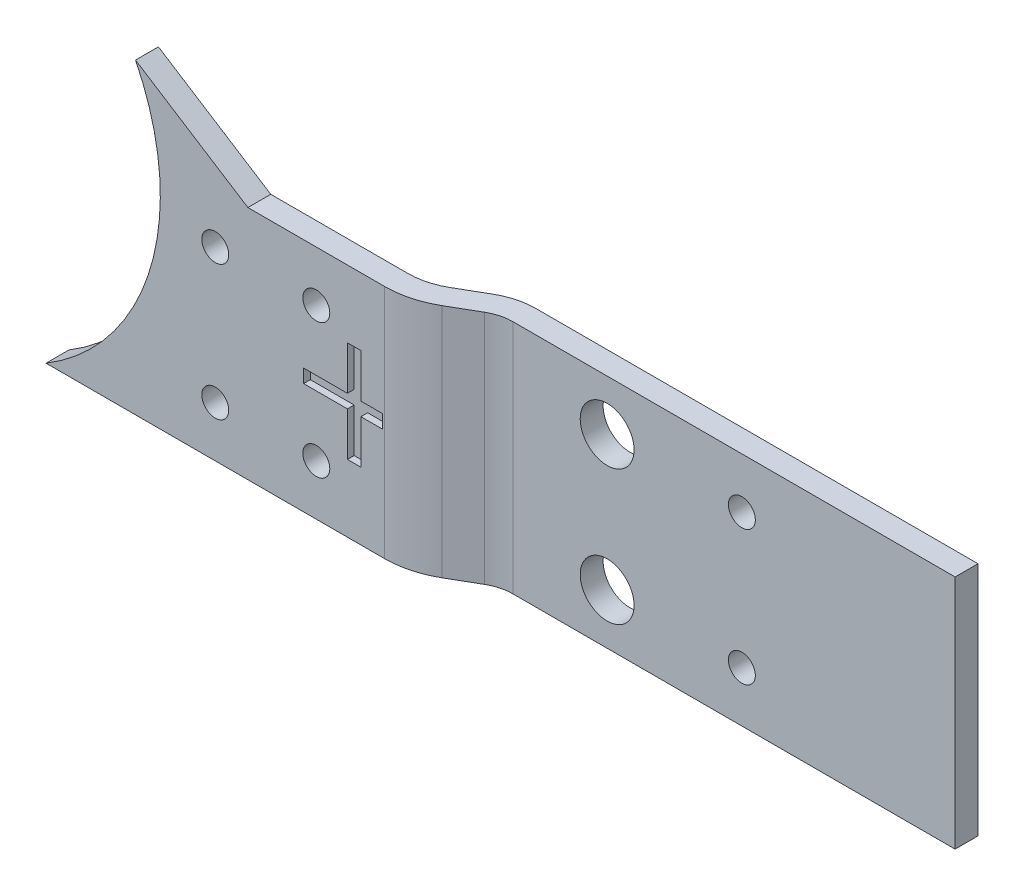
ISO-10303-21;
HEADER;
FILE_DESCRIPTION(('STEP AP214'),'2;1');
FILE_NAME('part.step','',(''),(''),'','','');
FILE_SCHEMA(('AUTOMOTIVE_DESIGN { 1 0 10303 214 1 1 1 1 }'));
ENDSEC;
DATA;
#1=APPLICATION_CONTEXT('core data for automotive mechanical design processes');
#2=APPLICATION_PROTOCOL_DEFINITION('international standard','automotive_design',2000,#1);
#3=PRODUCT_CONTEXT('',#1,'mechanical');
#4=PRODUCT('Part','Part','',(#3));
#5=PRODUCT_RELATED_PRODUCT_CATEGORY('part','',(#4));
#6=PRODUCT_DEFINITION_FORMATION('','',#4);
#7=PRODUCT_DEFINITION_CONTEXT('part definition',#1,'design');
#8=PRODUCT_DEFINITION('design','',#6,#7);
#9=PRODUCT_DEFINITION_SHAPE('','',#8);
#10=(LENGTH_UNIT() NAMED_UNIT(*) SI_UNIT(.MILLI.,.METRE.));
#11=(NAMED_UNIT(*) PLANE_ANGLE_UNIT() SI_UNIT($,.RADIAN.));
#12=(NAMED_UNIT(*) SI_UNIT($,.STERADIAN.) SOLID_ANGLE_UNIT());
#13=UNCERTAINTY_MEASURE_WITH_UNIT(LENGTH_MEASURE(1.E-05),#10,'distance_accuracy_value','');
#14=(GEOMETRIC_REPRESENTATION_CONTEXT(3) GLOBAL_UNCERTAINTY_ASSIGNED_CONTEXT((#13)) GLOBAL_UNIT_ASSIGNED_CONTEXT((#10,
#11,#12)) REPRESENTATION_CONTEXT('',''));
#15=CARTESIAN_POINT('',(0.,0.,0.));
#16=DIRECTION('',(0.,0.,1.));
#17=DIRECTION('',(1.,0.,0.));
#18=AXIS2_PLACEMENT_3D('',#15,#16,#17);
#19=CARTESIAN_POINT('',(0.,0.,3.4));
#20=DIRECTION('',(0.,0.,1.));
#21=DIRECTION('',(1.,0.,0.));
#22=AXIS2_PLACEMENT_3D('',#19,#20,#21);
#23=PLANE('',#22);
#24=CARTESIAN_POINT('',(58.1602540378444,-2.5,3.4));
#25=DIRECTION('',(0.,0.,1.));
#26=DIRECTION('',(1.,0.,0.));
#27=AXIS2_PLACEMENT_3D('',#24,#25,#26);
#28=CIRCLE('',#27,2.);
#29=CARTESIAN_POINT('',(60.1602540378444,-2.5,3.4));
#30=VERTEX_POINT('',#29);
#31=EDGE_CURVE('E817',#30,#30,#28,.F.);
#32=ORIENTED_EDGE('',*,*,#31,.T.);
#33=EDGE_LOOP('',(#32));
#34=FACE_BOUND('',#33,.T.);
#35=CARTESIAN_POINT('',(43.1602540378444,-22.5,3.4));
#36=DIRECTION('',(0.,0.,1.));
#37=DIRECTION('',(1.,0.,0.));
#38=AXIS2_PLACEMENT_3D('',#35,#36,#37);
#39=CIRCLE('',#38,2.);
#40=CARTESIAN_POINT('',(45.1602540378444,-22.5,3.4));
#41=VERTEX_POINT('',#40);
#42=EDGE_CURVE('E812',#41,#41,#39,.F.);
#43=ORIENTED_EDGE('',*,*,#42,.T.);
#44=EDGE_LOOP('',(#43));
#45=FACE_BOUND('',#44,.T.);
#46=CARTESIAN_POINT('',(43.1602540378444,-2.5,3.4));
#47=DIRECTION('',(0.,0.,1.));
#48=DIRECTION('',(1.,0.,0.));
#49=AXIS2_PLACEMENT_3D('',#46,#47,#48);
#50=CIRCLE('',#49,2.);
#51=CARTESIAN_POINT('',(45.1602540378444,-2.5,3.4));
#52=VERTEX_POINT('',#51);
#53=EDGE_CURVE('E798',#52,#52,#50,.F.);
#54=ORIENTED_EDGE('',*,*,#53,.T.);
#55=EDGE_LOOP('',(#54));
#56=FACE_BOUND('',#55,.T.);
#57=CARTESIAN_POINT('',(58.1602540378444,-22.5,3.4));
#58=DIRECTION('',(0.,0.,1.));
#59=DIRECTION('',(1.,0.,0.));
#60=AXIS2_PLACEMENT_3D('',#57,#58,#59);
#61=CIRCLE('',#60,2.);
#62=CARTESIAN_POINT('',(60.1602540378444,-22.5,3.4));
#63=VERTEX_POINT('',#62);
#64=EDGE_CURVE('E398',#63,#63,#61,.F.);
#65=ORIENTED_EDGE('',*,*,#64,.T.);
#66=EDGE_LOOP('',(#65));
#67=FACE_BOUND('',#66,.T.);
#68=DIRECTION('',(0.,1.,0.));
#69=VECTOR('',#68,1.);
#70=CARTESIAN_POINT('',(68.3205080756887,-110.439791148411,3.4));
#71=LINE('',#70,#69);
#72=CARTESIAN_POINT('',(68.3205080756887,-30.,3.4));
#73=VERTEX_POINT('',#72);
#74=CARTESIAN_POINT('',(68.3205080756887,5.,3.4));
#75=VERTEX_POINT('',#74);
#76=EDGE_CURVE('E220',#73,#75,#71,.T.);
#77=ORIENTED_EDGE('',*,*,#76,.T.);
#78=DIRECTION('',(-1.,0.,0.));
#79=VECTOR('',#78,1.);
#80=CARTESIAN_POINT('',(80.,5.,3.4));
#81=LINE('',#80,#79);
#82=CARTESIAN_POINT('',(48.,5.,3.4));
#83=VERTEX_POINT('',#82);
#84=EDGE_CURVE('E206',#75,#83,#81,.T.);
#85=ORIENTED_EDGE('',*,*,#84,.T.);
#86=DIRECTION('',(-0.843495742575284,0.537135860148408,0.));
#87=VECTOR('',#86,1.);
#88=CARTESIAN_POINT('',(48.,5.,3.4));
#89=LINE('',#88,#87);
#90=CARTESIAN_POINT('',(31.3204115569061,15.6215178489808,3.4));
#91=VERTEX_POINT('',#90);
#92=EDGE_CURVE('E216',#83,#91,#89,.T.);
#93=ORIENTED_EDGE('',*,*,#92,.T.);
#94=CARTESIAN_POINT('',(0.,0.,3.4));
#95=DIRECTION('',(0.,0.,1.));
#96=DIRECTION('',(1.,0.,0.));
#97=AXIS2_PLACEMENT_3D('',#94,#95,#96);
#98=CIRCLE('',#97,35.);
#99=CARTESIAN_POINT('',(18.02775637732,-30.,3.4));
#100=VERTEX_POINT('',#99);
#101=EDGE_CURVE('E61',#100,#91,#98,.T.);
#102=ORIENTED_EDGE('',*,*,#101,.F.);
#103=DIRECTION('',(1.,0.,0.));
#104=VECTOR('',#103,1.);
#105=CARTESIAN_POINT('',(0.,-30.,3.4));
#106=LINE('',#105,#104);
#107=EDGE_CURVE('E217',#100,#73,#106,.T.);
#108=ORIENTED_EDGE('',*,*,#107,.T.);
#109=EDGE_LOOP('',(#77,#85,#93,#102,#108));
#110=FACE_BOUND('',#109,.T.);
#111=DIRECTION('',(-1.,0.,0.));
#112=VECTOR('',#111,1.);
#113=CARTESIAN_POINT('',(0.,-11.5,3.4));
#114=LINE('',#113,#112);
#115=CARTESIAN_POINT('',(68.,-11.5,3.4));
#116=VERTEX_POINT('',#115);
#117=CARTESIAN_POINT('',(64.7753826404039,-11.5,3.4));
#118=VERTEX_POINT('',#117);
#119=EDGE_CURVE('E323',#116,#118,#114,.T.);
#120=ORIENTED_EDGE('',*,*,#119,.F.);
#121=DIRECTION('',(0.,1.,0.));
#122=VECTOR('',#121,1.);
#123=CARTESIAN_POINT('',(68.,-110.439791148411,3.4));
#124=LINE('',#123,#122);
#125=CARTESIAN_POINT('',(68.,-13.5,3.4));
#126=VERTEX_POINT('',#125);
#127=EDGE_CURVE('E226',#126,#116,#124,.T.);
#128=ORIENTED_EDGE('',*,*,#127,.F.);
#129=DIRECTION('',(-1.,0.,0.));
#130=VECTOR('',#129,1.);
#131=CARTESIAN_POINT('',(0.,-13.5,3.4));
#132=LINE('',#131,#130);
#133=CARTESIAN_POINT('',(64.7753826404039,-13.5,3.4));
#134=VERTEX_POINT('',#133);
#135=EDGE_CURVE('E53',#126,#134,#132,.T.);
#136=ORIENTED_EDGE('',*,*,#135,.T.);
#137=DIRECTION('',(0.,-1.,0.));
#138=VECTOR('',#137,1.);
#139=CARTESIAN_POINT('',(64.7753826404039,0.,3.4));
#140=LINE('',#139,#138);
#141=CARTESIAN_POINT('',(64.7753826404039,-20.,3.4));
#142=VERTEX_POINT('',#141);
#143=EDGE_CURVE('E289',#134,#142,#140,.T.);
#144=ORIENTED_EDGE('',*,*,#143,.T.);
#145=DIRECTION('',(-1.,0.,0.));
#146=VECTOR('',#145,1.);
#147=CARTESIAN_POINT('',(0.,-20.0000000000001,3.4));
#148=LINE('',#147,#146);
#149=CARTESIAN_POINT('',(62.7753826404039,-20.,3.4));
#150=VERTEX_POINT('',#149);
#151=EDGE_CURVE('E294',#142,#150,#148,.T.);
#152=ORIENTED_EDGE('',*,*,#151,.T.);
#153=DIRECTION('',(0.,-1.,0.));
#154=VECTOR('',#153,1.);
#155=CARTESIAN_POINT('',(62.7753826404039,0.,3.4));
#156=LINE('',#155,#154);
#157=CARTESIAN_POINT('',(62.7753826404039,-13.5,3.4));
#158=VERTEX_POINT('',#157);
#159=EDGE_CURVE('E343',#158,#150,#156,.T.);
#160=ORIENTED_EDGE('',*,*,#159,.F.);
#161=DIRECTION('',(-1.,0.,0.));
#162=VECTOR('',#161,1.);
#163=CARTESIAN_POINT('',(0.,-13.5,3.4));
#164=LINE('',#163,#162);
#165=CARTESIAN_POINT('',(56.2753826404039,-13.5,3.4));
#166=VERTEX_POINT('',#165);
#167=EDGE_CURVE('E340',#158,#166,#164,.T.);
#168=ORIENTED_EDGE('',*,*,#167,.T.);
#169=DIRECTION('',(0.,-1.,0.));
#170=VECTOR('',#169,1.);
#171=CARTESIAN_POINT('',(56.2753826404039,0.,3.4));
#172=LINE('',#171,#170);
#173=CARTESIAN_POINT('',(56.2753826404039,-11.5,3.4));
#174=VERTEX_POINT('',#173);
#175=EDGE_CURVE('E337',#174,#166,#172,.T.);
#176=ORIENTED_EDGE('',*,*,#175,.F.);
#177=DIRECTION('',(-1.,0.,0.));
#178=VECTOR('',#177,1.);
#179=CARTESIAN_POINT('',(0.,-11.5,3.4));
#180=LINE('',#179,#178);
#181=CARTESIAN_POINT('',(62.7753826404039,-11.5,3.4));
#182=VERTEX_POINT('',#181);
#183=EDGE_CURVE('E334',#182,#174,#180,.T.);
#184=ORIENTED_EDGE('',*,*,#183,.F.);
#185=DIRECTION('',(0.,-1.,0.));
#186=VECTOR('',#185,1.);
#187=CARTESIAN_POINT('',(62.7753826404039,0.,3.4));
#188=LINE('',#187,#186);
#189=CARTESIAN_POINT('',(62.7753826404039,-4.99999999999999,3.4));
#190=VERTEX_POINT('',#189);
#191=EDGE_CURVE('E331',#190,#182,#188,.T.);
#192=ORIENTED_EDGE('',*,*,#191,.F.);
#193=DIRECTION('',(-1.,0.,0.));
#194=VECTOR('',#193,1.);
#195=CARTESIAN_POINT('',(0.,-4.99999999999999,3.4));
#196=LINE('',#195,#194);
#197=CARTESIAN_POINT('',(64.7753826404039,-4.99999999999999,3.4));
#198=VERTEX_POINT('',#197);
#199=EDGE_CURVE('E328',#198,#190,#196,.T.);
#200=ORIENTED_EDGE('',*,*,#199,.F.);
#201=DIRECTION('',(0.,-1.,0.));
#202=VECTOR('',#201,1.);
#203=CARTESIAN_POINT('',(64.7753826404039,0.,3.4));
#204=LINE('',#203,#202);
#205=EDGE_CURVE('E325',#198,#118,#204,.T.);
#206=ORIENTED_EDGE('',*,*,#205,.T.);
#207=EDGE_LOOP('',(#120,#128,#136,#144,#152,#160,#168,#176,#184,#192,#200,#206));
#208=FACE_BOUND('',#207,.T.);
#209=ADVANCED_FACE('F36',(#34,#45,#56,#67,#110,#208),#23,.T.);
#210=CARTESIAN_POINT('',(0.,0.,0.));
#211=DIRECTION('',(0.,0.,1.));
#212=DIRECTION('',(1.,0.,0.));
#213=AXIS2_PLACEMENT_3D('',#210,#211,#212);
#214=PLANE('',#213);
#215=CARTESIAN_POINT('',(58.1602540378444,-2.5,0.));
#216=DIRECTION('',(0.,0.,-1.));
#217=DIRECTION('',(-1.,0.,0.));
#218=AXIS2_PLACEMENT_3D('',#215,#216,#217);
#219=CIRCLE('',#218,2.);
#220=CARTESIAN_POINT('',(56.1602540378444,-2.5,0.));
#221=VERTEX_POINT('',#220);
#222=EDGE_CURVE('E814',#221,#221,#219,.T.);
#223=ORIENTED_EDGE('',*,*,#222,.F.);
#224=EDGE_LOOP('',(#223));
#225=FACE_BOUND('',#224,.T.);
#226=CARTESIAN_POINT('',(43.1602540378444,-22.5,0.));
#227=DIRECTION('',(0.,0.,-1.));
#228=DIRECTION('',(-1.,0.,0.));
#229=AXIS2_PLACEMENT_3D('',#226,#227,#228);
#230=CIRCLE('',#229,2.);
#231=CARTESIAN_POINT('',(41.1602540378444,-22.5,0.));
#232=VERTEX_POINT('',#231);
#233=EDGE_CURVE('E819',#232,#232,#230,.T.);
#234=ORIENTED_EDGE('',*,*,#233,.F.);
#235=EDGE_LOOP('',(#234));
#236=FACE_BOUND('',#235,.T.);
#237=CARTESIAN_POINT('',(43.1602540378444,-2.5,0.));
#238=DIRECTION('',(0.,0.,-1.));
#239=DIRECTION('',(-1.,0.,0.));
#240=AXIS2_PLACEMENT_3D('',#237,#238,#239);
#241=CIRCLE('',#240,2.);
#242=CARTESIAN_POINT('',(41.1602540378444,-2.5,0.));
#243=VERTEX_POINT('',#242);
#244=EDGE_CURVE('E801',#243,#243,#241,.T.);
#245=ORIENTED_EDGE('',*,*,#244,.F.);
#246=EDGE_LOOP('',(#245));
#247=FACE_BOUND('',#246,.T.);
#248=CARTESIAN_POINT('',(58.1602540378444,-22.5,0.));
#249=DIRECTION('',(0.,0.,-1.));
#250=DIRECTION('',(-1.,0.,0.));
#251=AXIS2_PLACEMENT_3D('',#248,#249,#250);
#252=CIRCLE('',#251,2.);
#253=CARTESIAN_POINT('',(56.1602540378444,-22.5,0.));
#254=VERTEX_POINT('',#253);
#255=EDGE_CURVE('E395',#254,#254,#252,.T.);
#256=ORIENTED_EDGE('',*,*,#255,.F.);
#257=EDGE_LOOP('',(#256));
#258=FACE_BOUND('',#257,.T.);
#259=DIRECTION('',(-1.,0.,0.));
#260=VECTOR('',#259,1.);
#261=CARTESIAN_POINT('',(80.,5.,0.));
#262=LINE('',#261,#260);
#263=CARTESIAN_POINT('',(68.3205080756887,5.,0.));
#264=VERTEX_POINT('',#263);
#265=CARTESIAN_POINT('',(48.,5.,0.));
#266=VERTEX_POINT('',#265);
#267=EDGE_CURVE('E381',#264,#266,#262,.T.);
#268=ORIENTED_EDGE('',*,*,#267,.F.);
#269=DIRECTION('',(0.,1.,0.));
#270=VECTOR('',#269,1.);
#271=CARTESIAN_POINT('',(68.3205080756887,-110.439791148411,0.));
#272=LINE('',#271,#270);
#273=CARTESIAN_POINT('',(68.3205080756887,-30.,0.));
#274=VERTEX_POINT('',#273);
#275=EDGE_CURVE('E261',#274,#264,#272,.T.);
#276=ORIENTED_EDGE('',*,*,#275,.F.);
#277=DIRECTION('',(1.,0.,0.));
#278=VECTOR('',#277,1.);
#279=CARTESIAN_POINT('',(0.,-30.,0.));
#280=LINE('',#279,#278);
#281=CARTESIAN_POINT('',(18.02775637732,-30.,0.));
#282=VERTEX_POINT('',#281);
#283=EDGE_CURVE('E376',#282,#274,#280,.T.);
#284=ORIENTED_EDGE('',*,*,#283,.F.);
#285=CARTESIAN_POINT('',(0.,0.,0.));
#286=DIRECTION('',(0.,0.,-1.));
#287=DIRECTION('',(-1.,0.,0.));
#288=AXIS2_PLACEMENT_3D('',#285,#286,#287);
#289=CIRCLE('',#288,35.);
#290=CARTESIAN_POINT('',(31.3204115569061,15.6215178489808,0.));
#291=VERTEX_POINT('',#290);
#292=EDGE_CURVE('E351',#291,#282,#289,.T.);
#293=ORIENTED_EDGE('',*,*,#292,.F.);
#294=DIRECTION('',(-0.843495742575284,0.537135860148408,0.));
#295=VECTOR('',#294,1.);
#296=CARTESIAN_POINT('',(48.,5.,0.));
#297=LINE('',#296,#295);
#298=EDGE_CURVE('E377',#266,#291,#297,.T.);
#299=ORIENTED_EDGE('',*,*,#298,.F.);
#300=EDGE_LOOP('',(#268,#276,#284,#293,#299));
#301=FACE_BOUND('',#300,.T.);
#302=ADVANCED_FACE('F465',(#225,#236,#247,#258,#301),#214,.F.);
#303=CARTESIAN_POINT('',(0.,-30.,3.4));
#304=DIRECTION('',(0.,1.,0.));
#305=DIRECTION('',(-1.,0.,0.));
#306=AXIS2_PLACEMENT_3D('',#303,#304,#305);
#307=PLANE('',#306);
#308=ORIENTED_EDGE('',*,*,#283,.T.);
#309=CARTESIAN_POINT('',(68.3205080756888,-30.,-10.));
#310=DIRECTION('',(0.,1.,0.));
#311=DIRECTION('',(-1.,0.,0.));
#312=AXIS2_PLACEMENT_3D('',#309,#310,#311);
#313=CIRCLE('',#312,10.);
#314=CARTESIAN_POINT('',(73.3205080756888,-30.,-1.33974596215563));
#315=VERTEX_POINT('',#314);
#316=EDGE_CURVE('E238',#274,#315,#313,.T.);
#317=ORIENTED_EDGE('',*,*,#316,.T.);
#318=DIRECTION('',(0.866025403784437,0.,-0.500000000000002));
#319=VECTOR('',#318,1.);
#320=CARTESIAN_POINT('',(73.3205080756888,-30.,-1.33974596215564));
#321=LINE('',#320,#319);
#322=CARTESIAN_POINT('',(77.3397459621556,-30.,-3.66025403784437));
#323=VERTEX_POINT('',#322);
#324=EDGE_CURVE('E413',#315,#323,#321,.T.);
#325=ORIENTED_EDGE('',*,*,#324,.T.);
#326=CARTESIAN_POINT('',(82.3397459621556,-30.,5.));
#327=DIRECTION('',(0.,1.,0.));
#328=DIRECTION('',(-1.,0.,0.));
#329=AXIS2_PLACEMENT_3D('',#326,#327,#328);
#330=CIRCLE('',#329,10.);
#331=CARTESIAN_POINT('',(82.3397459621556,-30.,-5.));
#332=VERTEX_POINT('',#331);
#333=EDGE_CURVE('E412',#323,#332,#330,.F.);
#334=ORIENTED_EDGE('',*,*,#333,.T.);
#335=DIRECTION('',(1.,0.,0.));
#336=VECTOR('',#335,1.);
#337=CARTESIAN_POINT('',(82.3397459621556,-30.,-5.));
#338=LINE('',#337,#336);
#339=CARTESIAN_POINT('',(148.,-30.,-5.));
#340=VERTEX_POINT('',#339);
#341=EDGE_CURVE('E410',#332,#340,#338,.T.);
#342=ORIENTED_EDGE('',*,*,#341,.T.);
#343=DIRECTION('',(0.,0.,1.));
#344=VECTOR('',#343,1.);
#345=CARTESIAN_POINT('',(148.,-30.,-1.6));
#346=LINE('',#345,#344);
#347=CARTESIAN_POINT('',(148.,-30.,-1.6));
#348=VERTEX_POINT('',#347);
#349=EDGE_CURVE('E408',#340,#348,#346,.T.);
#350=ORIENTED_EDGE('',*,*,#349,.T.);
#351=DIRECTION('',(-1.,0.,0.));
#352=VECTOR('',#351,1.);
#353=CARTESIAN_POINT('',(83.,-30.,-1.6));
#354=LINE('',#353,#352);
#355=CARTESIAN_POINT('',(82.3397459621556,-30.,-1.59999999999999));
#356=VERTEX_POINT('',#355);
#357=EDGE_CURVE('E406',#348,#356,#354,.T.);
#358=ORIENTED_EDGE('',*,*,#357,.T.);
#359=CARTESIAN_POINT('',(82.3397459621556,-30.,5.));
#360=DIRECTION('',(0.,1.,0.));
#361=DIRECTION('',(-1.,0.,0.));
#362=AXIS2_PLACEMENT_3D('',#359,#360,#361);
#363=CIRCLE('',#362,6.59999999999999);
#364=CARTESIAN_POINT('',(79.0397459621556,-30.,-0.715767664977264));
#365=VERTEX_POINT('',#364);
#366=EDGE_CURVE('E404',#356,#365,#363,.T.);
#367=ORIENTED_EDGE('',*,*,#366,.T.);
#368=DIRECTION('',(-0.866025403784439,0.,0.5));
#369=VECTOR('',#368,1.);
#370=CARTESIAN_POINT('',(75.0205080756889,-30.,1.60474041071144));
#371=LINE('',#370,#369);
#372=CARTESIAN_POINT('',(75.0205080756889,-30.,1.60474041071143));
#373=VERTEX_POINT('',#372);
#374=EDGE_CURVE('E402',#365,#373,#371,.T.);
#375=ORIENTED_EDGE('',*,*,#374,.T.);
#376=CARTESIAN_POINT('',(68.3205080756888,-30.,-10.));
#377=DIRECTION('',(0.,1.,0.));
#378=DIRECTION('',(-1.,0.,0.));
#379=AXIS2_PLACEMENT_3D('',#376,#377,#378);
#380=CIRCLE('',#379,13.4);
#381=EDGE_CURVE('E264',#373,#73,#380,.F.);
#382=ORIENTED_EDGE('',*,*,#381,.T.);
#383=ORIENTED_EDGE('',*,*,#107,.F.);
#384=DIRECTION('',(0.,0.,-1.));
#385=VECTOR('',#384,1.);
#386=CARTESIAN_POINT('',(18.02775637732,-30.,10.));
#387=LINE('',#386,#385);
#388=EDGE_CURVE('E373',#100,#282,#387,.T.);
#389=ORIENTED_EDGE('',*,*,#388,.T.);
#390=EDGE_LOOP('',(#308,#317,#325,#334,#342,#350,#358,#367,#375,#382,#383,#389));
#391=FACE_BOUND('',#390,.T.);
#392=ADVANCED_FACE('F38',(#391),#307,.F.);
#393=CARTESIAN_POINT('',(80.,5.,3.4));
#394=DIRECTION('',(0.,-1.,0.));
#395=DIRECTION('',(1.,0.,0.));
#396=AXIS2_PLACEMENT_3D('',#393,#394,#395);
#397=PLANE('',#396);
#398=ORIENTED_EDGE('',*,*,#84,.F.);
#399=CARTESIAN_POINT('',(68.3205080756888,5.,-10.));
#400=DIRECTION('',(0.,1.,0.));
#401=DIRECTION('',(-1.,0.,0.));
#402=AXIS2_PLACEMENT_3D('',#399,#400,#401);
#403=CIRCLE('',#402,13.4);
#404=CARTESIAN_POINT('',(75.0205080756888,5.,1.60474041071144));
#405=VERTEX_POINT('',#404);
#406=EDGE_CURVE('E211',#75,#405,#403,.T.);
#407=ORIENTED_EDGE('',*,*,#406,.T.);
#408=DIRECTION('',(0.866025403784439,0.,-0.5));
#409=VECTOR('',#408,1.);
#410=CARTESIAN_POINT('',(75.0205080756888,5.,1.60474041071144));
#411=LINE('',#410,#409);
#412=CARTESIAN_POINT('',(79.0397459621556,5.,-0.715767664977262));
#413=VERTEX_POINT('',#412);
#414=EDGE_CURVE('E231',#405,#413,#411,.T.);
#415=ORIENTED_EDGE('',*,*,#414,.T.);
#416=CARTESIAN_POINT('',(82.3397459621556,5.,5.));
#417=DIRECTION('',(0.,-1.,0.));
#418=DIRECTION('',(1.,0.,0.));
#419=AXIS2_PLACEMENT_3D('',#416,#417,#418);
#420=CIRCLE('',#419,6.59999999999999);
#421=CARTESIAN_POINT('',(82.3397459621556,5.,-1.6));
#422=VERTEX_POINT('',#421);
#423=EDGE_CURVE('E233',#413,#422,#420,.T.);
#424=ORIENTED_EDGE('',*,*,#423,.T.);
#425=DIRECTION('',(1.,0.,0.));
#426=VECTOR('',#425,1.);
#427=CARTESIAN_POINT('',(83.,5.,-1.6));
#428=LINE('',#427,#426);
#429=CARTESIAN_POINT('',(148.,5.00000000000001,-1.6));
#430=VERTEX_POINT('',#429);
#431=EDGE_CURVE('E243',#422,#430,#428,.T.);
#432=ORIENTED_EDGE('',*,*,#431,.T.);
#433=DIRECTION('',(0.,0.,-1.));
#434=VECTOR('',#433,1.);
#435=CARTESIAN_POINT('',(148.,5.00000000000001,-1.6));
#436=LINE('',#435,#434);
#437=CARTESIAN_POINT('',(148.,5.00000000000001,-5.));
#438=VERTEX_POINT('',#437);
#439=EDGE_CURVE('E246',#430,#438,#436,.T.);
#440=ORIENTED_EDGE('',*,*,#439,.T.);
#441=DIRECTION('',(-1.,0.,0.));
#442=VECTOR('',#441,1.);
#443=CARTESIAN_POINT('',(82.3397459621556,5.,-5.));
#444=LINE('',#443,#442);
#445=CARTESIAN_POINT('',(82.3397459621556,5.,-5.));
#446=VERTEX_POINT('',#445);
#447=EDGE_CURVE('E249',#438,#446,#444,.T.);
#448=ORIENTED_EDGE('',*,*,#447,.T.);
#449=CARTESIAN_POINT('',(82.3397459621556,5.,5.));
#450=DIRECTION('',(0.,1.,0.));
#451=DIRECTION('',(1.,0.,0.));
#452=AXIS2_PLACEMENT_3D('',#449,#450,#451);
#453=CIRCLE('',#452,10.);
#454=CARTESIAN_POINT('',(77.3397459621555,5.,-3.66025403784436));
#455=VERTEX_POINT('',#454);
#456=EDGE_CURVE('E252',#446,#455,#453,.T.);
#457=ORIENTED_EDGE('',*,*,#456,.T.);
#458=DIRECTION('',(-0.866025403784437,0.,0.500000000000002));
#459=VECTOR('',#458,1.);
#460=CARTESIAN_POINT('',(73.3205080756888,5.,-1.33974596215564));
#461=LINE('',#460,#459);
#462=CARTESIAN_POINT('',(73.3205080756888,5.,-1.33974596215564));
#463=VERTEX_POINT('',#462);
#464=EDGE_CURVE('E255',#455,#463,#461,.T.);
#465=ORIENTED_EDGE('',*,*,#464,.T.);
#466=CARTESIAN_POINT('',(68.3205080756888,5.,-10.));
#467=DIRECTION('',(0.,-1.,0.));
#468=DIRECTION('',(-1.,0.,0.));
#469=AXIS2_PLACEMENT_3D('',#466,#467,#468);
#470=CIRCLE('',#469,10.);
#471=EDGE_CURVE('E258',#463,#264,#470,.T.);
#472=ORIENTED_EDGE('',*,*,#471,.T.);
#473=ORIENTED_EDGE('',*,*,#267,.T.);
#474=DIRECTION('',(0.,0.,-1.));
#475=VECTOR('',#474,1.);
#476=CARTESIAN_POINT('',(48.,5.,3.4));
#477=LINE('',#476,#475);
#478=EDGE_CURVE('E45',#83,#266,#477,.T.);
#479=ORIENTED_EDGE('',*,*,#478,.F.);
#480=EDGE_LOOP('',(#398,#407,#415,#424,#432,#440,#448,#457,#465,#472,#473,#479));
#481=FACE_BOUND('',#480,.T.);
#482=ADVANCED_FACE('F208',(#481),#397,.F.);
#483=CARTESIAN_POINT('',(48.,5.,3.4));
#484=DIRECTION('',(-0.537135860148408,-0.843495742575284,0.));
#485=DIRECTION('',(0.843495742575284,-0.537135860148408,0.));
#486=AXIS2_PLACEMENT_3D('',#483,#484,#485);
#487=PLANE('',#486);
#488=ORIENTED_EDGE('',*,*,#298,.T.);
#489=DIRECTION('',(0.,0.,-1.));
#490=VECTOR('',#489,1.);
#491=CARTESIAN_POINT('',(31.3204115569061,15.6215178489808,10.));
#492=LINE('',#491,#490);
#493=EDGE_CURVE('E11',#291,#91,#492,.F.);
#494=ORIENTED_EDGE('',*,*,#493,.T.);
#495=ORIENTED_EDGE('',*,*,#92,.F.);
#496=ORIENTED_EDGE('',*,*,#478,.T.);
#497=EDGE_LOOP('',(#488,#494,#495,#496));
#498=FACE_BOUND('',#497,.T.);
#499=ADVANCED_FACE('F480',(#498),#487,.F.);
#500=CARTESIAN_POINT('',(0.,0.,10.));
#501=DIRECTION('',(0.,0.,-1.));
#502=DIRECTION('',(-1.,0.,0.));
#503=AXIS2_PLACEMENT_3D('',#500,#501,#502);
#504=CYLINDRICAL_SURFACE('',#503,35.);
#505=ORIENTED_EDGE('',*,*,#101,.T.);
#506=ORIENTED_EDGE('',*,*,#493,.F.);
#507=ORIENTED_EDGE('',*,*,#292,.T.);
#508=ORIENTED_EDGE('',*,*,#388,.F.);
#509=EDGE_LOOP('',(#505,#506,#507,#508));
#510=FACE_BOUND('',#509,.T.);
#511=ADVANCED_FACE('F477',(#510),#504,.F.);
#512=CARTESIAN_POINT('',(64.7753826404039,0.,2.4));
#513=DIRECTION('',(-1.,0.,0.));
#514=DIRECTION('',(0.,0.,1.));
#515=AXIS2_PLACEMENT_3D('',#512,#513,#514);
#516=PLANE('',#515);
#517=ORIENTED_EDGE('',*,*,#143,.F.);
#518=DIRECTION('',(0.,0.,1.));
#519=VECTOR('',#518,1.);
#520=CARTESIAN_POINT('',(64.7753826404039,-13.5,2.4));
#521=LINE('',#520,#519);
#522=CARTESIAN_POINT('',(64.7753826404039,-13.5,2.4));
#523=VERTEX_POINT('',#522);
#524=EDGE_CURVE('E320',#523,#134,#521,.T.);
#525=ORIENTED_EDGE('',*,*,#524,.F.);
#526=DIRECTION('',(0.,-1.,0.));
#527=VECTOR('',#526,1.);
#528=CARTESIAN_POINT('',(64.7753826404039,0.,2.4));
#529=LINE('',#528,#527);
#530=CARTESIAN_POINT('',(64.7753826404039,-20.,2.4));
#531=VERTEX_POINT('',#530);
#532=EDGE_CURVE('E290',#523,#531,#529,.T.);
#533=ORIENTED_EDGE('',*,*,#532,.T.);
#534=DIRECTION('',(0.,0.,1.));
#535=VECTOR('',#534,1.);
#536=CARTESIAN_POINT('',(64.7753826404039,-20.,2.4));
#537=LINE('',#536,#535);
#538=EDGE_CURVE('E348',#531,#142,#537,.T.);
#539=ORIENTED_EDGE('',*,*,#538,.T.);
#540=EDGE_LOOP('',(#517,#525,#533,#539));
#541=FACE_BOUND('',#540,.T.);
#542=ADVANCED_FACE('F606',(#541),#516,.T.);
#543=CARTESIAN_POINT('',(0.,-20.0000000000001,2.4));
#544=DIRECTION('',(0.,1.,0.));
#545=DIRECTION('',(-1.,0.,0.));
#546=AXIS2_PLACEMENT_3D('',#543,#544,#545);
#547=PLANE('',#546);
#548=ORIENTED_EDGE('',*,*,#151,.F.);
#549=ORIENTED_EDGE('',*,*,#538,.F.);
#550=DIRECTION('',(-1.,0.,0.));
#551=VECTOR('',#550,1.);
#552=CARTESIAN_POINT('',(0.,-20.0000000000001,2.4));
#553=LINE('',#552,#551);
#554=CARTESIAN_POINT('',(62.7753826404039,-20.,2.4));
#555=VERTEX_POINT('',#554);
#556=EDGE_CURVE('E318',#531,#555,#553,.T.);
#557=ORIENTED_EDGE('',*,*,#556,.T.);
#558=DIRECTION('',(0.,0.,1.));
#559=VECTOR('',#558,1.);
#560=CARTESIAN_POINT('',(62.7753826404039,-20.,2.4));
#561=LINE('',#560,#559);
#562=EDGE_CURVE('E352',#555,#150,#561,.T.);
#563=ORIENTED_EDGE('',*,*,#562,.T.);
#564=EDGE_LOOP('',(#548,#549,#557,#563));
#565=FACE_BOUND('',#564,.T.);
#566=ADVANCED_FACE('F598',(#565),#547,.T.);
#567=CARTESIAN_POINT('',(62.7753826404039,0.,2.4));
#568=DIRECTION('',(-1.,0.,0.));
#569=DIRECTION('',(0.,0.,1.));
#570=AXIS2_PLACEMENT_3D('',#567,#568,#569);
#571=PLANE('',#570);
#572=ORIENTED_EDGE('',*,*,#159,.T.);
#573=ORIENTED_EDGE('',*,*,#562,.F.);
#574=DIRECTION('',(0.,-1.,0.));
#575=VECTOR('',#574,1.);
#576=CARTESIAN_POINT('',(62.7753826404039,0.,2.4));
#577=LINE('',#576,#575);
#578=CARTESIAN_POINT('',(62.7753826404039,-13.5,2.4));
#579=VERTEX_POINT('',#578);
#580=EDGE_CURVE('E315',#579,#555,#577,.T.);
#581=ORIENTED_EDGE('',*,*,#580,.F.);
#582=DIRECTION('',(0.,0.,1.));
#583=VECTOR('',#582,1.);
#584=CARTESIAN_POINT('',(62.7753826404039,-13.5,2.4));
#585=LINE('',#584,#583);
#586=EDGE_CURVE('E354',#579,#158,#585,.T.);
#587=ORIENTED_EDGE('',*,*,#586,.T.);
#588=EDGE_LOOP('',(#572,#573,#581,#587));
#589=FACE_BOUND('',#588,.T.);
#590=ADVANCED_FACE('F589',(#589),#571,.F.);
#591=CARTESIAN_POINT('',(0.,-13.5,2.4));
#592=DIRECTION('',(0.,1.,0.));
#593=DIRECTION('',(-1.,0.,0.));
#594=AXIS2_PLACEMENT_3D('',#591,#592,#593);
#595=PLANE('',#594);
#596=ORIENTED_EDGE('',*,*,#167,.F.);
#597=ORIENTED_EDGE('',*,*,#586,.F.);
#598=DIRECTION('',(-1.,0.,0.));
#599=VECTOR('',#598,1.);
#600=CARTESIAN_POINT('',(0.,-13.5,2.4));
#601=LINE('',#600,#599);
#602=CARTESIAN_POINT('',(56.2753826404039,-13.5,2.4));
#603=VERTEX_POINT('',#602);
#604=EDGE_CURVE('E313',#579,#603,#601,.T.);
#605=ORIENTED_EDGE('',*,*,#604,.T.);
#606=DIRECTION('',(0.,0.,1.));
#607=VECTOR('',#606,1.);
#608=CARTESIAN_POINT('',(56.2753826404039,-13.5,2.4));
#609=LINE('',#608,#607);
#610=EDGE_CURVE('E356',#603,#166,#609,.T.);
#611=ORIENTED_EDGE('',*,*,#610,.T.);
#612=EDGE_LOOP('',(#596,#597,#605,#611));
#613=FACE_BOUND('',#612,.T.);
#614=ADVANCED_FACE('F580',(#613),#595,.T.);
#615=CARTESIAN_POINT('',(56.2753826404039,0.,2.4));
#616=DIRECTION('',(-1.,0.,0.));
#617=DIRECTION('',(0.,0.,1.));
#618=AXIS2_PLACEMENT_3D('',#615,#616,#617);
#619=PLANE('',#618);
#620=ORIENTED_EDGE('',*,*,#175,.T.);
#621=ORIENTED_EDGE('',*,*,#610,.F.);
#622=DIRECTION('',(0.,-1.,0.));
#623=VECTOR('',#622,1.);
#624=CARTESIAN_POINT('',(56.2753826404039,0.,2.4));
#625=LINE('',#624,#623);
#626=CARTESIAN_POINT('',(56.2753826404039,-11.5,2.4));
#627=VERTEX_POINT('',#626);
#628=EDGE_CURVE('E310',#627,#603,#625,.T.);
#629=ORIENTED_EDGE('',*,*,#628,.F.);
#630=DIRECTION('',(0.,0.,1.));
#631=VECTOR('',#630,1.);
#632=CARTESIAN_POINT('',(56.2753826404039,-11.5,2.4));
#633=LINE('',#632,#631);
#634=EDGE_CURVE('E358',#627,#174,#633,.T.);
#635=ORIENTED_EDGE('',*,*,#634,.T.);
#636=EDGE_LOOP('',(#620,#621,#629,#635));
#637=FACE_BOUND('',#636,.T.);
#638=ADVANCED_FACE('F571',(#637),#619,.F.);
#639=CARTESIAN_POINT('',(0.,-11.5,2.4));
#640=DIRECTION('',(0.,1.,0.));
#641=DIRECTION('',(0.,0.,1.));
#642=AXIS2_PLACEMENT_3D('',#639,#640,#641);
#643=PLANE('',#642);
#644=ORIENTED_EDGE('',*,*,#183,.T.);
#645=ORIENTED_EDGE('',*,*,#634,.F.);
#646=DIRECTION('',(-1.,0.,0.));
#647=VECTOR('',#646,1.);
#648=CARTESIAN_POINT('',(0.,-11.5,2.4));
#649=LINE('',#648,#647);
#650=CARTESIAN_POINT('',(62.7753826404039,-11.5,2.4));
#651=VERTEX_POINT('',#650);
#652=EDGE_CURVE('E307',#651,#627,#649,.T.);
#653=ORIENTED_EDGE('',*,*,#652,.F.);
#654=DIRECTION('',(0.,0.,1.));
#655=VECTOR('',#654,1.);
#656=CARTESIAN_POINT('',(62.7753826404039,-11.5,2.4));
#657=LINE('',#656,#655);
#658=EDGE_CURVE('E360',#651,#182,#657,.T.);
#659=ORIENTED_EDGE('',*,*,#658,.T.);
#660=EDGE_LOOP('',(#644,#645,#653,#659));
#661=FACE_BOUND('',#660,.T.);
#662=ADVANCED_FACE('F562',(#661),#643,.F.);
#663=CARTESIAN_POINT('',(62.7753826404039,0.,2.4));
#664=DIRECTION('',(-1.,0.,0.));
#665=DIRECTION('',(0.,0.,1.));
#666=AXIS2_PLACEMENT_3D('',#663,#664,#665);
#667=PLANE('',#666);
#668=ORIENTED_EDGE('',*,*,#191,.T.);
#669=ORIENTED_EDGE('',*,*,#658,.F.);
#670=DIRECTION('',(0.,-1.,0.));
#671=VECTOR('',#670,1.);
#672=CARTESIAN_POINT('',(62.7753826404039,0.,2.4));
#673=LINE('',#672,#671);
#674=CARTESIAN_POINT('',(62.7753826404039,-4.99999999999999,2.4));
#675=VERTEX_POINT('',#674);
#676=EDGE_CURVE('E304',#675,#651,#673,.T.);
#677=ORIENTED_EDGE('',*,*,#676,.F.);
#678=DIRECTION('',(0.,0.,1.));
#679=VECTOR('',#678,1.);
#680=CARTESIAN_POINT('',(62.7753826404039,-4.99999999999999,2.4));
#681=LINE('',#680,#679);
#682=EDGE_CURVE('E362',#675,#190,#681,.T.);
#683=ORIENTED_EDGE('',*,*,#682,.T.);
#684=EDGE_LOOP('',(#668,#669,#677,#683));
#685=FACE_BOUND('',#684,.T.);
#686=ADVANCED_FACE('F553',(#685),#667,.F.);
#687=CARTESIAN_POINT('',(0.,-4.99999999999999,2.4));
#688=DIRECTION('',(0.,1.,0.));
#689=DIRECTION('',(0.,0.,1.));
#690=AXIS2_PLACEMENT_3D('',#687,#688,#689);
#691=PLANE('',#690);
#692=ORIENTED_EDGE('',*,*,#199,.T.);
#693=ORIENTED_EDGE('',*,*,#682,.F.);
#694=DIRECTION('',(-1.,0.,0.));
#695=VECTOR('',#694,1.);
#696=CARTESIAN_POINT('',(0.,-4.99999999999999,2.4));
#697=LINE('',#696,#695);
#698=CARTESIAN_POINT('',(64.7753826404039,-4.99999999999999,2.4));
#699=VERTEX_POINT('',#698);
#700=EDGE_CURVE('E301',#699,#675,#697,.T.);
#701=ORIENTED_EDGE('',*,*,#700,.F.);
#702=DIRECTION('',(0.,0.,1.));
#703=VECTOR('',#702,1.);
#704=CARTESIAN_POINT('',(64.7753826404039,-4.99999999999999,2.4));
#705=LINE('',#704,#703);
#706=EDGE_CURVE('E364',#699,#198,#705,.T.);
#707=ORIENTED_EDGE('',*,*,#706,.T.);
#708=EDGE_LOOP('',(#692,#693,#701,#707));
#709=FACE_BOUND('',#708,.T.);
#710=ADVANCED_FACE('F544',(#709),#691,.F.);
#711=CARTESIAN_POINT('',(64.7753826404039,0.,2.4));
#712=DIRECTION('',(-1.,0.,0.));
#713=DIRECTION('',(0.,0.,1.));
#714=AXIS2_PLACEMENT_3D('',#711,#712,#713);
#715=PLANE('',#714);
#716=ORIENTED_EDGE('',*,*,#205,.F.);
#717=ORIENTED_EDGE('',*,*,#706,.F.);
#718=DIRECTION('',(0.,-1.,0.));
#719=VECTOR('',#718,1.);
#720=CARTESIAN_POINT('',(64.7753826404039,0.,2.4));
#721=LINE('',#720,#719);
#722=CARTESIAN_POINT('',(64.7753826404039,-11.5,2.4));
#723=VERTEX_POINT('',#722);
#724=EDGE_CURVE('E298',#699,#723,#721,.T.);
#725=ORIENTED_EDGE('',*,*,#724,.T.);
#726=DIRECTION('',(0.,0.,1.));
#727=VECTOR('',#726,1.);
#728=CARTESIAN_POINT('',(64.7753826404039,-11.5,2.4));
#729=LINE('',#728,#727);
#730=EDGE_CURVE('E366',#723,#118,#729,.T.);
#731=ORIENTED_EDGE('',*,*,#730,.T.);
#732=EDGE_LOOP('',(#716,#717,#725,#731));
#733=FACE_BOUND('',#732,.T.);
#734=ADVANCED_FACE('F536',(#733),#715,.T.);
#735=CARTESIAN_POINT('',(0.,-11.5,2.4));
#736=DIRECTION('',(0.,1.,0.));
#737=DIRECTION('',(0.,0.,1.));
#738=AXIS2_PLACEMENT_3D('',#735,#736,#737);
#739=PLANE('',#738);
#740=DIRECTION('',(-1.,0.,0.));
#741=VECTOR('',#740,1.);
#742=CARTESIAN_POINT('',(0.,-11.5,2.4));
#743=LINE('',#742,#741);
#744=CARTESIAN_POINT('',(68.,-11.5,2.4));
#745=VERTEX_POINT('',#744);
#746=EDGE_CURVE('E296',#745,#723,#743,.T.);
#747=ORIENTED_EDGE('',*,*,#746,.F.);
#748=DIRECTION('',(0.,0.,-1.));
#749=VECTOR('',#748,1.);
#750=CARTESIAN_POINT('',(68.,-11.5,3.401));
#751=LINE('',#750,#749);
#752=EDGE_CURVE('E287',#116,#745,#751,.T.);
#753=ORIENTED_EDGE('',*,*,#752,.F.);
#754=ORIENTED_EDGE('',*,*,#119,.T.);
#755=ORIENTED_EDGE('',*,*,#730,.F.);
#756=EDGE_LOOP('',(#747,#753,#754,#755));
#757=FACE_BOUND('',#756,.T.);
#758=ADVANCED_FACE('F527',(#757),#739,.F.);
#759=CARTESIAN_POINT('',(0.,-13.5,2.4));
#760=DIRECTION('',(0.,1.,0.));
#761=DIRECTION('',(-1.,0.,0.));
#762=AXIS2_PLACEMENT_3D('',#759,#760,#761);
#763=PLANE('',#762);
#764=DIRECTION('',(0.,0.,-1.));
#765=VECTOR('',#764,1.);
#766=CARTESIAN_POINT('',(68.,-13.5,3.401));
#767=LINE('',#766,#765);
#768=CARTESIAN_POINT('',(68.,-13.5,2.4));
#769=VERTEX_POINT('',#768);
#770=EDGE_CURVE('E284',#126,#769,#767,.T.);
#771=ORIENTED_EDGE('',*,*,#770,.T.);
#772=DIRECTION('',(-1.,0.,0.));
#773=VECTOR('',#772,1.);
#774=CARTESIAN_POINT('',(0.,-13.5,2.4));
#775=LINE('',#774,#773);
#776=EDGE_CURVE('E293',#769,#523,#775,.T.);
#777=ORIENTED_EDGE('',*,*,#776,.T.);
#778=ORIENTED_EDGE('',*,*,#524,.T.);
#779=ORIENTED_EDGE('',*,*,#135,.F.);
#780=EDGE_LOOP('',(#771,#777,#778,#779));
#781=FACE_BOUND('',#780,.T.);
#782=ADVANCED_FACE('F517',(#781),#763,.T.);
#783=CARTESIAN_POINT('',(0.,0.,2.4));
#784=DIRECTION('',(0.,0.,1.));
#785=DIRECTION('',(1.,0.,0.));
#786=AXIS2_PLACEMENT_3D('',#783,#784,#785);
#787=PLANE('',#786);
#788=DIRECTION('',(0.,1.,0.));
#789=VECTOR('',#788,1.);
#790=CARTESIAN_POINT('',(68.,-30.,2.4));
#791=LINE('',#790,#789);
#792=EDGE_CURVE('E281',#769,#745,#791,.T.);
#793=ORIENTED_EDGE('',*,*,#792,.T.);
#794=ORIENTED_EDGE('',*,*,#746,.T.);
#795=ORIENTED_EDGE('',*,*,#724,.F.);
#796=ORIENTED_EDGE('',*,*,#700,.T.);
#797=ORIENTED_EDGE('',*,*,#676,.T.);
#798=ORIENTED_EDGE('',*,*,#652,.T.);
#799=ORIENTED_EDGE('',*,*,#628,.T.);
#800=ORIENTED_EDGE('',*,*,#604,.F.);
#801=ORIENTED_EDGE('',*,*,#580,.T.);
#802=ORIENTED_EDGE('',*,*,#556,.F.);
#803=ORIENTED_EDGE('',*,*,#532,.F.);
#804=ORIENTED_EDGE('',*,*,#776,.F.);
#805=EDGE_LOOP('',(#793,#794,#795,#796,#797,#798,#799,#800,#801,#802,#803,#804));
#806=FACE_BOUND('',#805,.T.);
#807=ADVANCED_FACE('F510',(#806),#787,.T.);
#808=CARTESIAN_POINT('',(68.,-110.439791148411,0.));
#809=DIRECTION('',(-1.,0.,0.));
#810=DIRECTION('',(0.,-1.,0.));
#811=AXIS2_PLACEMENT_3D('',#808,#809,#810);
#812=PLANE('',#811);
#813=ORIENTED_EDGE('',*,*,#127,.T.);
#814=ORIENTED_EDGE('',*,*,#752,.T.);
#815=ORIENTED_EDGE('',*,*,#792,.F.);
#816=ORIENTED_EDGE('',*,*,#770,.F.);
#817=EDGE_LOOP('',(#813,#814,#815,#816));
#818=FACE_BOUND('',#817,.T.);
#819=ADVANCED_FACE('F516',(#818),#812,.T.);
#820=CARTESIAN_POINT('',(68.3205080756888,-110.439791148411,-10.));
#821=DIRECTION('',(0.,1.,0.));
#822=DIRECTION('',(-1.,0.,0.));
#823=AXIS2_PLACEMENT_3D('',#820,#821,#822);
#824=CYLINDRICAL_SURFACE('',#823,10.);
#825=ORIENTED_EDGE('',*,*,#316,.F.);
#826=ORIENTED_EDGE('',*,*,#275,.T.);
#827=ORIENTED_EDGE('',*,*,#471,.F.);
#828=DIRECTION('',(0.,1.,0.));
#829=VECTOR('',#828,1.);
#830=CARTESIAN_POINT('',(73.3205080756888,-110.439791148411,-1.33974596215564));
#831=LINE('',#830,#829);
#832=EDGE_CURVE('E265',#315,#463,#831,.T.);
#833=ORIENTED_EDGE('',*,*,#832,.F.);
#834=EDGE_LOOP('',(#825,#826,#827,#833));
#835=FACE_BOUND('',#834,.T.);
#836=ADVANCED_FACE('F427',(#835),#824,.F.);
#837=CARTESIAN_POINT('',(73.3205080756888,-110.439791148411,-1.33974596215564));
#838=DIRECTION('',(-0.500000000000002,0.,-0.866025403784437));
#839=DIRECTION('',(-0.866025403784437,0.,0.500000000000002));
#840=AXIS2_PLACEMENT_3D('',#837,#838,#839);
#841=PLANE('',#840);
#842=ORIENTED_EDGE('',*,*,#324,.F.);
#843=ORIENTED_EDGE('',*,*,#832,.T.);
#844=ORIENTED_EDGE('',*,*,#464,.F.);
#845=DIRECTION('',(0.,1.,0.));
#846=VECTOR('',#845,1.);
#847=CARTESIAN_POINT('',(77.3397459621556,-110.439791148411,-3.66025403784436));
#848=LINE('',#847,#846);
#849=EDGE_CURVE('E267',#323,#455,#848,.T.);
#850=ORIENTED_EDGE('',*,*,#849,.F.);
#851=EDGE_LOOP('',(#842,#843,#844,#850));
#852=FACE_BOUND('',#851,.T.);
#853=ADVANCED_FACE('F424',(#852),#841,.T.);
#854=CARTESIAN_POINT('',(82.3397459621556,-110.439791148411,5.));
#855=DIRECTION('',(0.,1.,0.));
#856=DIRECTION('',(-1.,0.,0.));
#857=AXIS2_PLACEMENT_3D('',#854,#855,#856);
#858=CYLINDRICAL_SURFACE('',#857,10.);
#859=ORIENTED_EDGE('',*,*,#333,.F.);
#860=ORIENTED_EDGE('',*,*,#849,.T.);
#861=ORIENTED_EDGE('',*,*,#456,.F.);
#862=DIRECTION('',(0.,1.,0.));
#863=VECTOR('',#862,1.);
#864=CARTESIAN_POINT('',(82.3397459621556,-110.439791148411,-5.));
#865=LINE('',#864,#863);
#866=EDGE_CURVE('E269',#332,#446,#865,.T.);
#867=ORIENTED_EDGE('',*,*,#866,.F.);
#868=EDGE_LOOP('',(#859,#860,#861,#867));
#869=FACE_BOUND('',#868,.T.);
#870=ADVANCED_FACE('F432',(#869),#858,.T.);
#871=CARTESIAN_POINT('',(82.3397459621556,-110.439791148411,-5.));
#872=DIRECTION('',(0.,0.,-1.));
#873=DIRECTION('',(-1.,0.,0.));
#874=AXIS2_PLACEMENT_3D('',#871,#872,#873);
#875=PLANE('',#874);
#876=CARTESIAN_POINT('',(116.339745962156,-22.5,-5.));
#877=DIRECTION('',(0.,0.,-1.));
#878=DIRECTION('',(-1.,0.,0.));
#879=AXIS2_PLACEMENT_3D('',#876,#877,#878);
#880=CIRCLE('',#879,2.);
#881=CARTESIAN_POINT('',(114.339745962156,-22.5,-5.));
#882=VERTEX_POINT('',#881);
#883=EDGE_CURVE('E797',#882,#882,#880,.T.);
#884=ORIENTED_EDGE('',*,*,#883,.F.);
#885=EDGE_LOOP('',(#884));
#886=FACE_BOUND('',#885,.T.);
#887=CARTESIAN_POINT('',(116.339745962156,-2.49999999999999,-5.));
#888=DIRECTION('',(0.,0.,-1.));
#889=DIRECTION('',(-1.,0.,0.));
#890=AXIS2_PLACEMENT_3D('',#887,#888,#889);
#891=CIRCLE('',#890,2.);
#892=CARTESIAN_POINT('',(114.339745962156,-2.49999999999999,-5.));
#893=VERTEX_POINT('',#892);
#894=EDGE_CURVE('E803',#893,#893,#891,.T.);
#895=ORIENTED_EDGE('',*,*,#894,.F.);
#896=EDGE_LOOP('',(#895));
#897=FACE_BOUND('',#896,.T.);
#898=CARTESIAN_POINT('',(96.3397459621556,-2.49999999999999,-5.));
#899=DIRECTION('',(0.,0.,-1.));
#900=DIRECTION('',(-1.,0.,0.));
#901=AXIS2_PLACEMENT_3D('',#898,#899,#900);
#902=CIRCLE('',#901,4.00000000000001);
#903=CARTESIAN_POINT('',(92.3397459621556,-2.49999999999999,-5.));
#904=VERTEX_POINT('',#903);
#905=EDGE_CURVE('E386',#904,#904,#902,.T.);
#906=ORIENTED_EDGE('',*,*,#905,.F.);
#907=EDGE_LOOP('',(#906));
#908=FACE_BOUND('',#907,.T.);
#909=CARTESIAN_POINT('',(96.3397459621556,-22.5,-5.));
#910=DIRECTION('',(0.,0.,-1.));
#911=DIRECTION('',(1.,0.,0.));
#912=AXIS2_PLACEMENT_3D('',#909,#910,#911);
#913=CIRCLE('',#912,4.00000000000001);
#914=CARTESIAN_POINT('',(100.339745962156,-22.5,-5.));
#915=VERTEX_POINT('',#914);
#916=EDGE_CURVE('E390',#915,#915,#913,.T.);
#917=ORIENTED_EDGE('',*,*,#916,.F.);
#918=EDGE_LOOP('',(#917));
#919=FACE_BOUND('',#918,.T.);
#920=ORIENTED_EDGE('',*,*,#341,.F.);
#921=ORIENTED_EDGE('',*,*,#866,.T.);
#922=ORIENTED_EDGE('',*,*,#447,.F.);
#923=DIRECTION('',(0.,1.,0.));
#924=VECTOR('',#923,1.);
#925=CARTESIAN_POINT('',(148.,-110.439791148411,-5.));
#926=LINE('',#925,#924);
#927=EDGE_CURVE('E271',#340,#438,#926,.T.);
#928=ORIENTED_EDGE('',*,*,#927,.F.);
#929=EDGE_LOOP('',(#920,#921,#922,#928));
#930=FACE_BOUND('',#929,.T.);
#931=ADVANCED_FACE('F437',(#886,#897,#908,#919,#930),#875,.T.);
#932=CARTESIAN_POINT('',(148.,-110.439791148411,-1.6));
#933=DIRECTION('',(1.,0.,0.));
#934=DIRECTION('',(0.,1.,0.));
#935=AXIS2_PLACEMENT_3D('',#932,#933,#934);
#936=PLANE('',#935);
#937=ORIENTED_EDGE('',*,*,#349,.F.);
#938=ORIENTED_EDGE('',*,*,#927,.T.);
#939=ORIENTED_EDGE('',*,*,#439,.F.);
#940=DIRECTION('',(0.,1.,0.));
#941=VECTOR('',#940,1.);
#942=CARTESIAN_POINT('',(148.,-110.439791148411,-1.6));
#943=LINE('',#942,#941);
#944=EDGE_CURVE('E273',#348,#430,#943,.T.);
#945=ORIENTED_EDGE('',*,*,#944,.F.);
#946=EDGE_LOOP('',(#937,#938,#939,#945));
#947=FACE_BOUND('',#946,.T.);
#948=ADVANCED_FACE('F440',(#947),#936,.T.);
#949=CARTESIAN_POINT('',(83.,-110.439791148411,-1.6));
#950=DIRECTION('',(0.,0.,1.));
#951=DIRECTION('',(1.,0.,0.));
#952=AXIS2_PLACEMENT_3D('',#949,#950,#951);
#953=PLANE('',#952);
#954=CARTESIAN_POINT('',(116.339745962156,-22.5,-1.6));
#955=DIRECTION('',(0.,0.,1.));
#956=DIRECTION('',(1.,0.,0.));
#957=AXIS2_PLACEMENT_3D('',#954,#955,#956);
#958=CIRCLE('',#957,2.);
#959=CARTESIAN_POINT('',(118.339745962156,-22.5,-1.6));
#960=VERTEX_POINT('',#959);
#961=EDGE_CURVE('E794',#960,#960,#958,.F.);
#962=ORIENTED_EDGE('',*,*,#961,.T.);
#963=EDGE_LOOP('',(#962));
#964=FACE_BOUND('',#963,.T.);
#965=CARTESIAN_POINT('',(116.339745962156,-2.49999999999999,-1.6));
#966=DIRECTION('',(0.,0.,1.));
#967=DIRECTION('',(1.,0.,0.));
#968=AXIS2_PLACEMENT_3D('',#965,#966,#967);
#969=CIRCLE('',#968,2.);
#970=CARTESIAN_POINT('',(118.339745962156,-2.49999999999999,-1.6));
#971=VERTEX_POINT('',#970);
#972=EDGE_CURVE('E808',#971,#971,#969,.F.);
#973=ORIENTED_EDGE('',*,*,#972,.T.);
#974=EDGE_LOOP('',(#973));
#975=FACE_BOUND('',#974,.T.);
#976=CARTESIAN_POINT('',(96.3397459621556,-2.49999999999999,-1.6));
#977=DIRECTION('',(0.,0.,1.));
#978=DIRECTION('',(1.,0.,0.));
#979=AXIS2_PLACEMENT_3D('',#976,#977,#978);
#980=CIRCLE('',#979,4.00000000000001);
#981=CARTESIAN_POINT('',(100.339745962156,-2.49999999999999,-1.6));
#982=VERTEX_POINT('',#981);
#983=EDGE_CURVE('E40',#982,#982,#980,.T.);
#984=ORIENTED_EDGE('',*,*,#983,.F.);
#985=EDGE_LOOP('',(#984));
#986=FACE_BOUND('',#985,.T.);
#987=CARTESIAN_POINT('',(96.3397459621556,-22.5,-1.6));
#988=DIRECTION('',(0.,0.,1.));
#989=DIRECTION('',(1.,0.,0.));
#990=AXIS2_PLACEMENT_3D('',#987,#988,#989);
#991=CIRCLE('',#990,4.00000000000001);
#992=CARTESIAN_POINT('',(100.339745962156,-22.5,-1.6));
#993=VERTEX_POINT('',#992);
#994=EDGE_CURVE('E236',#993,#993,#991,.T.);
#995=ORIENTED_EDGE('',*,*,#994,.F.);
#996=EDGE_LOOP('',(#995));
#997=FACE_BOUND('',#996,.T.);
#998=ORIENTED_EDGE('',*,*,#357,.F.);
#999=ORIENTED_EDGE('',*,*,#944,.T.);
#1000=ORIENTED_EDGE('',*,*,#431,.F.);
#1001=DIRECTION('',(0.,1.,0.));
#1002=VECTOR('',#1001,1.);
#1003=CARTESIAN_POINT('',(82.3397459621556,-110.439791148411,-1.6));
#1004=LINE('',#1003,#1002);
#1005=EDGE_CURVE('E275',#356,#422,#1004,.T.);
#1006=ORIENTED_EDGE('',*,*,#1005,.F.);
#1007=EDGE_LOOP('',(#998,#999,#1000,#1006));
#1008=FACE_BOUND('',#1007,.T.);
#1009=ADVANCED_FACE('F446',(#964,#975,#986,#997,#1008),#953,.T.);
#1010=CARTESIAN_POINT('',(82.3397459621556,-110.439791148411,5.));
#1011=DIRECTION('',(0.,1.,0.));
#1012=DIRECTION('',(-1.,0.,0.));
#1013=AXIS2_PLACEMENT_3D('',#1010,#1011,#1012);
#1014=CYLINDRICAL_SURFACE('',#1013,6.59999999999999);
#1015=ORIENTED_EDGE('',*,*,#366,.F.);
#1016=ORIENTED_EDGE('',*,*,#1005,.T.);
#1017=ORIENTED_EDGE('',*,*,#423,.F.);
#1018=DIRECTION('',(0.,1.,0.));
#1019=VECTOR('',#1018,1.);
#1020=CARTESIAN_POINT('',(79.0397459621556,-110.439791148411,-0.715767664977262));
#1021=LINE('',#1020,#1019);
#1022=EDGE_CURVE('E277',#365,#413,#1021,.T.);
#1023=ORIENTED_EDGE('',*,*,#1022,.F.);
#1024=EDGE_LOOP('',(#1015,#1016,#1017,#1023));
#1025=FACE_BOUND('',#1024,.T.);
#1026=ADVANCED_FACE('F450',(#1025),#1014,.F.);
#1027=CARTESIAN_POINT('',(75.0205080756889,-110.439791148411,1.60474041071144));
#1028=DIRECTION('',(0.5,0.,0.866025403784438));
#1029=DIRECTION('',(0.866025403784439,0.,-0.5));
#1030=AXIS2_PLACEMENT_3D('',#1027,#1028,#1029);
#1031=PLANE('',#1030);
#1032=ORIENTED_EDGE('',*,*,#374,.F.);
#1033=ORIENTED_EDGE('',*,*,#1022,.T.);
#1034=ORIENTED_EDGE('',*,*,#414,.F.);
#1035=DIRECTION('',(0.,1.,0.));
#1036=VECTOR('',#1035,1.);
#1037=CARTESIAN_POINT('',(75.0205080756889,-110.439791148411,1.60474041071144));
#1038=LINE('',#1037,#1036);
#1039=EDGE_CURVE('E225',#373,#405,#1038,.T.);
#1040=ORIENTED_EDGE('',*,*,#1039,.F.);
#1041=EDGE_LOOP('',(#1032,#1033,#1034,#1040));
#1042=FACE_BOUND('',#1041,.T.);
#1043=ADVANCED_FACE('F454',(#1042),#1031,.T.);
#1044=CARTESIAN_POINT('',(68.3205080756888,-110.439791148411,-10.));
#1045=DIRECTION('',(0.,1.,0.));
#1046=DIRECTION('',(-1.,0.,0.));
#1047=AXIS2_PLACEMENT_3D('',#1044,#1045,#1046);
#1048=CYLINDRICAL_SURFACE('',#1047,13.4);
#1049=ORIENTED_EDGE('',*,*,#381,.F.);
#1050=ORIENTED_EDGE('',*,*,#1039,.T.);
#1051=ORIENTED_EDGE('',*,*,#406,.F.);
#1052=ORIENTED_EDGE('',*,*,#76,.F.);
#1053=EDGE_LOOP('',(#1049,#1050,#1051,#1052));
#1054=FACE_BOUND('',#1053,.T.);
#1055=ADVANCED_FACE('F228',(#1054),#1048,.T.);
#1056=CARTESIAN_POINT('',(96.3397459621556,-22.5,5.));
#1057=DIRECTION('',(0.,0.,-1.));
#1058=DIRECTION('',(-1.,0.,0.));
#1059=AXIS2_PLACEMENT_3D('',#1056,#1057,#1058);
#1060=CYLINDRICAL_SURFACE('',#1059,4.00000000000001);
#1061=ORIENTED_EDGE('',*,*,#994,.T.);
#1062=EDGE_LOOP('',(#1061));
#1063=FACE_BOUND('',#1062,.T.);
#1064=ORIENTED_EDGE('',*,*,#916,.T.);
#1065=EDGE_LOOP('',(#1064));
#1066=FACE_BOUND('',#1065,.T.);
#1067=ADVANCED_FACE('F461',(#1063,#1066),#1060,.F.);
#1068=CARTESIAN_POINT('',(96.3397459621556,-2.49999999999999,5.));
#1069=DIRECTION('',(0.,0.,-1.));
#1070=DIRECTION('',(-1.,0.,0.));
#1071=AXIS2_PLACEMENT_3D('',#1068,#1069,#1070);
#1072=CYLINDRICAL_SURFACE('',#1071,4.00000000000001);
#1073=ORIENTED_EDGE('',*,*,#983,.T.);
#1074=EDGE_LOOP('',(#1073));
#1075=FACE_BOUND('',#1074,.T.);
#1076=ORIENTED_EDGE('',*,*,#905,.T.);
#1077=EDGE_LOOP('',(#1076));
#1078=FACE_BOUND('',#1077,.T.);
#1079=ADVANCED_FACE('F720',(#1075,#1078),#1072,.F.);
#1080=CARTESIAN_POINT('',(58.1602540378444,-22.5,3.401));
#1081=DIRECTION('',(0.,0.,-1.));
#1082=DIRECTION('',(-1.,0.,0.));
#1083=AXIS2_PLACEMENT_3D('',#1080,#1081,#1082);
#1084=CYLINDRICAL_SURFACE('',#1083,2.);
#1085=ORIENTED_EDGE('',*,*,#64,.F.);
#1086=EDGE_LOOP('',(#1085));
#1087=FACE_BOUND('',#1086,.T.);
#1088=ORIENTED_EDGE('',*,*,#255,.T.);
#1089=EDGE_LOOP('',(#1088));
#1090=FACE_BOUND('',#1089,.T.);
#1091=ADVANCED_FACE('F727',(#1087,#1090),#1084,.F.);
#1092=CARTESIAN_POINT('',(43.1602540378444,-2.5,3.401));
#1093=DIRECTION('',(0.,0.,-1.));
#1094=DIRECTION('',(-1.,0.,0.));
#1095=AXIS2_PLACEMENT_3D('',#1092,#1093,#1094);
#1096=CYLINDRICAL_SURFACE('',#1095,2.);
#1097=ORIENTED_EDGE('',*,*,#53,.F.);
#1098=EDGE_LOOP('',(#1097));
#1099=FACE_BOUND('',#1098,.T.);
#1100=ORIENTED_EDGE('',*,*,#244,.T.);
#1101=EDGE_LOOP('',(#1100));
#1102=FACE_BOUND('',#1101,.T.);
#1103=ADVANCED_FACE('F735',(#1099,#1102),#1096,.F.);
#1104=CARTESIAN_POINT('',(43.1602540378444,-22.5,3.401));
#1105=DIRECTION('',(0.,0.,-1.));
#1106=DIRECTION('',(-1.,0.,0.));
#1107=AXIS2_PLACEMENT_3D('',#1104,#1105,#1106);
#1108=CYLINDRICAL_SURFACE('',#1107,2.);
#1109=ORIENTED_EDGE('',*,*,#42,.F.);
#1110=EDGE_LOOP('',(#1109));
#1111=FACE_BOUND('',#1110,.T.);
#1112=ORIENTED_EDGE('',*,*,#233,.T.);
#1113=EDGE_LOOP('',(#1112));
#1114=FACE_BOUND('',#1113,.T.);
#1115=ADVANCED_FACE('F744',(#1111,#1114),#1108,.F.);
#1116=CARTESIAN_POINT('',(58.1602540378444,-2.5,3.401));
#1117=DIRECTION('',(0.,0.,-1.));
#1118=DIRECTION('',(-1.,0.,0.));
#1119=AXIS2_PLACEMENT_3D('',#1116,#1117,#1118);
#1120=CYLINDRICAL_SURFACE('',#1119,2.);
#1121=ORIENTED_EDGE('',*,*,#31,.F.);
#1122=EDGE_LOOP('',(#1121));
#1123=FACE_BOUND('',#1122,.T.);
#1124=ORIENTED_EDGE('',*,*,#222,.T.);
#1125=EDGE_LOOP('',(#1124));
#1126=FACE_BOUND('',#1125,.T.);
#1127=ADVANCED_FACE('F753',(#1123,#1126),#1120,.F.);
#1128=CARTESIAN_POINT('',(116.339745962156,-2.49999999999999,3.401));
#1129=DIRECTION('',(0.,0.,-1.));
#1130=DIRECTION('',(-1.,0.,0.));
#1131=AXIS2_PLACEMENT_3D('',#1128,#1129,#1130);
#1132=CYLINDRICAL_SURFACE('',#1131,2.);
#1133=ORIENTED_EDGE('',*,*,#972,.F.);
#1134=EDGE_LOOP('',(#1133));
#1135=FACE_BOUND('',#1134,.T.);
#1136=ORIENTED_EDGE('',*,*,#894,.T.);
#1137=EDGE_LOOP('',(#1136));
#1138=FACE_BOUND('',#1137,.T.);
#1139=ADVANCED_FACE('F762',(#1135,#1138),#1132,.F.);
#1140=CARTESIAN_POINT('',(116.339745962156,-22.5,3.401));
#1141=DIRECTION('',(0.,0.,-1.));
#1142=DIRECTION('',(-1.,0.,0.));
#1143=AXIS2_PLACEMENT_3D('',#1140,#1141,#1142);
#1144=CYLINDRICAL_SURFACE('',#1143,2.);
#1145=ORIENTED_EDGE('',*,*,#961,.F.);
#1146=EDGE_LOOP('',(#1145));
#1147=FACE_BOUND('',#1146,.T.);
#1148=ORIENTED_EDGE('',*,*,#883,.T.);
#1149=EDGE_LOOP('',(#1148));
#1150=FACE_BOUND('',#1149,.T.);
#1151=ADVANCED_FACE('F771',(#1147,#1150),#1144,.F.);
#1152=CLOSED_SHELL('',(#209,#302,#392,#482,#499,#511,#542,#566,#590,#614,#638,#662,#686,#710,
#734,#758,#782,#807,#819,#836,#853,#870,#931,#948,#1009,#1026,#1043,#1055,#1067,#1079,#1091,
#1103,#1115,#1127,#1139,#1151));
#1153=MANIFOLD_SOLID_BREP('B2',#1152);
#1154=ADVANCED_BREP_SHAPE_REPRESENTATION('',(#18,#1153),#14);
#1155=SHAPE_DEFINITION_REPRESENTATION(#9,#1154);
ENDSEC;
END-ISO-10303-21;
